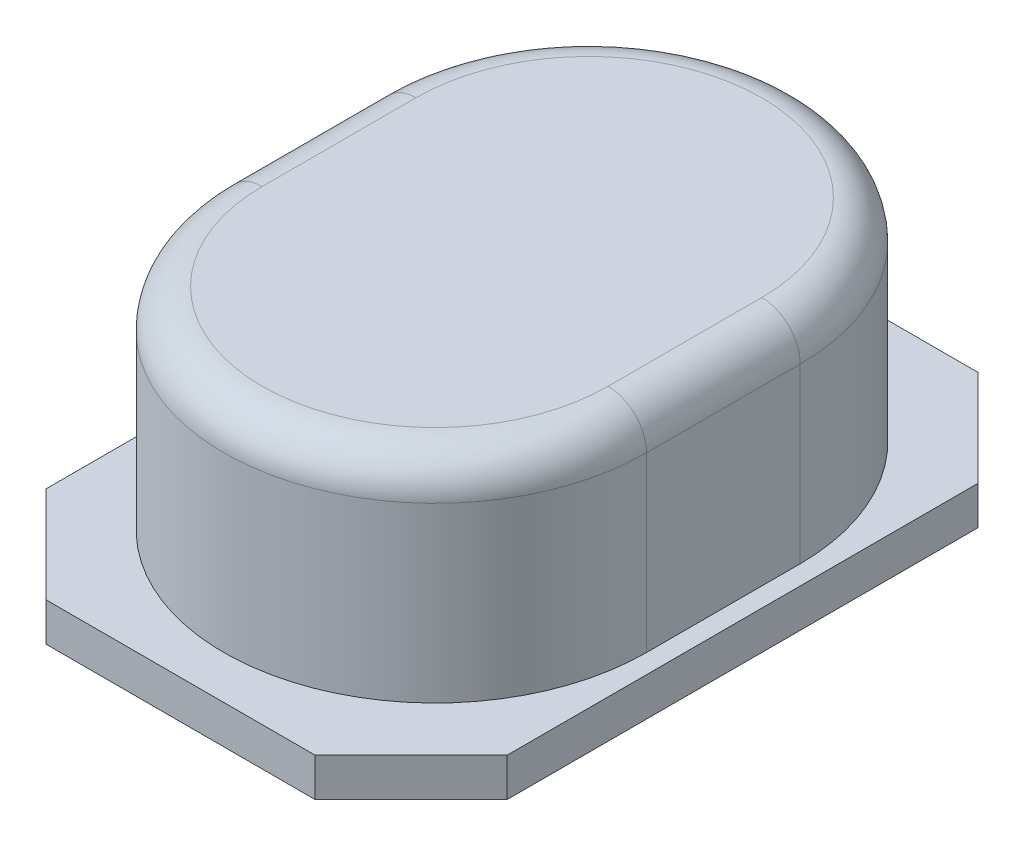
ISO-10303-21;
HEADER;
FILE_DESCRIPTION(('STEP AP214'),'2;1');
FILE_NAME('part.step','',(''),(''),'','','');
FILE_SCHEMA(('AUTOMOTIVE_DESIGN { 1 0 10303 214 1 1 1 1 }'));
ENDSEC;
DATA;
#1=APPLICATION_CONTEXT('core data for automotive mechanical design processes');
#2=APPLICATION_PROTOCOL_DEFINITION('international standard','automotive_design',2000,#1);
#3=PRODUCT_CONTEXT('',#1,'mechanical');
#4=PRODUCT('Part','Part','',(#3));
#5=PRODUCT_RELATED_PRODUCT_CATEGORY('part','',(#4));
#6=PRODUCT_DEFINITION_FORMATION('','',#4);
#7=PRODUCT_DEFINITION_CONTEXT('part definition',#1,'design');
#8=PRODUCT_DEFINITION('design','',#6,#7);
#9=PRODUCT_DEFINITION_SHAPE('','',#8);
#10=(LENGTH_UNIT() NAMED_UNIT(*) SI_UNIT(.MILLI.,.METRE.));
#11=(NAMED_UNIT(*) PLANE_ANGLE_UNIT() SI_UNIT($,.RADIAN.));
#12=(NAMED_UNIT(*) SI_UNIT($,.STERADIAN.) SOLID_ANGLE_UNIT());
#13=UNCERTAINTY_MEASURE_WITH_UNIT(LENGTH_MEASURE(1.E-05),#10,'distance_accuracy_value','');
#14=(GEOMETRIC_REPRESENTATION_CONTEXT(3) GLOBAL_UNCERTAINTY_ASSIGNED_CONTEXT((#13)) GLOBAL_UNIT_ASSIGNED_CONTEXT((#10,
#11,#12)) REPRESENTATION_CONTEXT('',''));
#15=CARTESIAN_POINT('',(0.,0.,0.));
#16=DIRECTION('',(0.,0.,1.));
#17=DIRECTION('',(1.,0.,0.));
#18=AXIS2_PLACEMENT_3D('',#15,#16,#17);
#19=CARTESIAN_POINT('',(0.,-0.5,0.));
#20=DIRECTION('',(0.,-1.,0.));
#21=DIRECTION('',(0.,0.,1.));
#22=AXIS2_PLACEMENT_3D('',#19,#20,#21);
#23=CYLINDRICAL_SURFACE('',#22,0.375);
#24=CARTESIAN_POINT('',(0.,-0.5,0.));
#25=DIRECTION('',(0.,1.,0.));
#26=DIRECTION('',(1.,0.,0.));
#27=AXIS2_PLACEMENT_3D('',#24,#25,#26);
#28=CIRCLE('',#27,0.375);
#29=CARTESIAN_POINT('',(0.,-0.5,-0.375));
#30=VERTEX_POINT('',#29);
#31=EDGE_CURVE('E432',#30,#30,#28,.T.);
#32=ORIENTED_EDGE('',*,*,#31,.T.);
#33=DIRECTION('',(0.,1.,0.));
#34=VECTOR('',#33,1.);
#35=CARTESIAN_POINT('',(0.,-0.5,-0.375));
#36=LINE('',#35,#34);
#37=CARTESIAN_POINT('',(0.,-0.2,-0.375));
#38=VERTEX_POINT('',#37);
#39=EDGE_CURVE('E11',#30,#38,#36,.T.);
#40=ORIENTED_EDGE('',*,*,#39,.T.);
#41=CARTESIAN_POINT('',(0.,-0.2,0.));
#42=DIRECTION('',(0.,1.,0.));
#43=DIRECTION('',(0.,0.,1.));
#44=AXIS2_PLACEMENT_3D('',#41,#42,#43);
#45=CIRCLE('',#44,0.375);
#46=CARTESIAN_POINT('',(0.15,-0.2,-0.343693177121688));
#47=VERTEX_POINT('',#46);
#48=EDGE_CURVE('E20',#47,#38,#45,.T.);
#49=ORIENTED_EDGE('',*,*,#48,.F.);
#50=DIRECTION('',(0.,-1.,0.));
#51=VECTOR('',#50,1.);
#52=CARTESIAN_POINT('',(0.15,-0.5,-0.343693177121688));
#53=LINE('',#52,#51);
#54=CARTESIAN_POINT('',(0.15,0.1,-0.343693177121688));
#55=VERTEX_POINT('',#54);
#56=EDGE_CURVE('E303',#55,#47,#53,.T.);
#57=ORIENTED_EDGE('',*,*,#56,.F.);
#58=CARTESIAN_POINT('',(0.,0.1,0.));
#59=DIRECTION('',(0.,1.,0.));
#60=DIRECTION('',(1.,0.,0.));
#61=AXIS2_PLACEMENT_3D('',#58,#59,#60);
#62=CIRCLE('',#61,0.375);
#63=CARTESIAN_POINT('',(0.343693177121688,0.1,-0.15));
#64=VERTEX_POINT('',#63);
#65=EDGE_CURVE('E27',#64,#55,#62,.T.);
#66=ORIENTED_EDGE('',*,*,#65,.F.);
#67=DIRECTION('',(0.,1.,0.));
#68=VECTOR('',#67,1.);
#69=CARTESIAN_POINT('',(0.343693177121688,-0.5,-0.15));
#70=LINE('',#69,#68);
#71=CARTESIAN_POINT('',(0.343693177121688,-0.2,-0.15));
#72=VERTEX_POINT('',#71);
#73=EDGE_CURVE('E307',#72,#64,#70,.T.);
#74=ORIENTED_EDGE('',*,*,#73,.F.);
#75=CARTESIAN_POINT('',(0.,-0.2,0.));
#76=DIRECTION('',(0.,1.,0.));
#77=DIRECTION('',(0.,0.,1.));
#78=AXIS2_PLACEMENT_3D('',#75,#76,#77);
#79=CIRCLE('',#78,0.375);
#80=CARTESIAN_POINT('',(0.343693177121688,-0.2,0.15));
#81=VERTEX_POINT('',#80);
#82=EDGE_CURVE('E368',#81,#72,#79,.T.);
#83=ORIENTED_EDGE('',*,*,#82,.F.);
#84=DIRECTION('',(0.,-1.,0.));
#85=VECTOR('',#84,1.);
#86=CARTESIAN_POINT('',(0.343693177121688,-0.5,0.15));
#87=LINE('',#86,#85);
#88=CARTESIAN_POINT('',(0.343693177121688,0.1,0.15));
#89=VERTEX_POINT('',#88);
#90=EDGE_CURVE('E485',#89,#81,#87,.T.);
#91=ORIENTED_EDGE('',*,*,#90,.F.);
#92=CARTESIAN_POINT('',(0.,0.1,0.));
#93=DIRECTION('',(0.,1.,0.));
#94=DIRECTION('',(1.,0.,0.));
#95=AXIS2_PLACEMENT_3D('',#92,#93,#94);
#96=CIRCLE('',#95,0.375);
#97=CARTESIAN_POINT('',(0.15,0.1,0.343693177121688));
#98=VERTEX_POINT('',#97);
#99=EDGE_CURVE('E325',#98,#89,#96,.T.);
#100=ORIENTED_EDGE('',*,*,#99,.F.);
#101=DIRECTION('',(0.,1.,0.));
#102=VECTOR('',#101,1.);
#103=CARTESIAN_POINT('',(0.15,-0.5,0.343693177121688));
#104=LINE('',#103,#102);
#105=CARTESIAN_POINT('',(0.15,-0.2,0.343693177121688));
#106=VERTEX_POINT('',#105);
#107=EDGE_CURVE('E354',#106,#98,#104,.T.);
#108=ORIENTED_EDGE('',*,*,#107,.F.);
#109=CARTESIAN_POINT('',(0.,-0.2,0.));
#110=DIRECTION('',(0.,1.,0.));
#111=DIRECTION('',(0.,0.,1.));
#112=AXIS2_PLACEMENT_3D('',#109,#110,#111);
#113=CIRCLE('',#112,0.375);
#114=CARTESIAN_POINT('',(-0.15,-0.2,0.343693177121688));
#115=VERTEX_POINT('',#114);
#116=EDGE_CURVE('E392',#115,#106,#113,.T.);
#117=ORIENTED_EDGE('',*,*,#116,.F.);
#118=DIRECTION('',(0.,-1.,0.));
#119=VECTOR('',#118,1.);
#120=CARTESIAN_POINT('',(-0.15,-0.5,0.343693177121688));
#121=LINE('',#120,#119);
#122=CARTESIAN_POINT('',(-0.15,0.1,0.343693177121688));
#123=VERTEX_POINT('',#122);
#124=EDGE_CURVE('E378',#123,#115,#121,.T.);
#125=ORIENTED_EDGE('',*,*,#124,.F.);
#126=CARTESIAN_POINT('',(0.,0.1,0.));
#127=DIRECTION('',(0.,1.,0.));
#128=DIRECTION('',(1.,0.,0.));
#129=AXIS2_PLACEMENT_3D('',#126,#127,#128);
#130=CIRCLE('',#129,0.375);
#131=CARTESIAN_POINT('',(-0.343693177121688,0.1,0.15));
#132=VERTEX_POINT('',#131);
#133=EDGE_CURVE('E498',#132,#123,#130,.T.);
#134=ORIENTED_EDGE('',*,*,#133,.F.);
#135=DIRECTION('',(0.,1.,0.));
#136=VECTOR('',#135,1.);
#137=CARTESIAN_POINT('',(-0.343693177121688,-0.5,0.15));
#138=LINE('',#137,#136);
#139=CARTESIAN_POINT('',(-0.343693177121688,-0.2,0.15));
#140=VERTEX_POINT('',#139);
#141=EDGE_CURVE('E361',#140,#132,#138,.T.);
#142=ORIENTED_EDGE('',*,*,#141,.F.);
#143=CARTESIAN_POINT('',(0.,-0.2,0.));
#144=DIRECTION('',(0.,1.,0.));
#145=DIRECTION('',(0.,0.,1.));
#146=AXIS2_PLACEMENT_3D('',#143,#144,#145);
#147=CIRCLE('',#146,0.375);
#148=CARTESIAN_POINT('',(-0.343693177121688,-0.2,-0.15));
#149=VERTEX_POINT('',#148);
#150=EDGE_CURVE('E312',#149,#140,#147,.T.);
#151=ORIENTED_EDGE('',*,*,#150,.F.);
#152=DIRECTION('',(0.,-1.,0.));
#153=VECTOR('',#152,1.);
#154=CARTESIAN_POINT('',(-0.343693177121688,-0.5,-0.15));
#155=LINE('',#154,#153);
#156=CARTESIAN_POINT('',(-0.343693177121688,0.1,-0.15));
#157=VERTEX_POINT('',#156);
#158=EDGE_CURVE('E135',#157,#149,#155,.T.);
#159=ORIENTED_EDGE('',*,*,#158,.F.);
#160=CARTESIAN_POINT('',(0.,0.1,0.));
#161=DIRECTION('',(0.,1.,0.));
#162=DIRECTION('',(1.,0.,0.));
#163=AXIS2_PLACEMENT_3D('',#160,#161,#162);
#164=CIRCLE('',#163,0.375);
#165=CARTESIAN_POINT('',(-0.15,0.1,-0.343693177121688));
#166=VERTEX_POINT('',#165);
#167=EDGE_CURVE('E305',#166,#157,#164,.T.);
#168=ORIENTED_EDGE('',*,*,#167,.F.);
#169=DIRECTION('',(0.,1.,0.));
#170=VECTOR('',#169,1.);
#171=CARTESIAN_POINT('',(-0.15,-0.5,-0.343693177121688));
#172=LINE('',#171,#170);
#173=CARTESIAN_POINT('',(-0.15,-0.2,-0.343693177121688));
#174=VERTEX_POINT('',#173);
#175=EDGE_CURVE('E501',#174,#166,#172,.T.);
#176=ORIENTED_EDGE('',*,*,#175,.F.);
#177=CARTESIAN_POINT('',(0.,-0.2,0.));
#178=DIRECTION('',(0.,1.,0.));
#179=DIRECTION('',(0.,0.,1.));
#180=AXIS2_PLACEMENT_3D('',#177,#178,#179);
#181=CIRCLE('',#180,0.375);
#182=EDGE_CURVE('E444',#38,#174,#181,.T.);
#183=ORIENTED_EDGE('',*,*,#182,.F.);
#184=ORIENTED_EDGE('',*,*,#39,.F.);
#185=EDGE_LOOP('',(#32,#40,#49,#57,#66,#74,#83,#91,#100,#108,#117,#125,#134,#142,#151,#159,#168,
#176,#183,#184));
#186=FACE_BOUND('',#185,.T.);
#187=ADVANCED_FACE('F16',(#186),#23,.T.);
#188=CARTESIAN_POINT('',(0.,0.1,0.));
#189=DIRECTION('',(0.,-1.,0.));
#190=DIRECTION('',(0.,0.,-1.));
#191=AXIS2_PLACEMENT_3D('',#188,#189,#190);
#192=PLANE('',#191);
#193=ORIENTED_EDGE('',*,*,#65,.T.);
#194=DIRECTION('',(0.,0.,-1.));
#195=VECTOR('',#194,1.);
#196=CARTESIAN_POINT('',(0.15,0.1,-0.15));
#197=LINE('',#196,#195);
#198=CARTESIAN_POINT('',(0.15,0.1,-0.734846922834954));
#199=VERTEX_POINT('',#198);
#200=EDGE_CURVE('E477',#55,#199,#197,.T.);
#201=ORIENTED_EDGE('',*,*,#200,.T.);
#202=CARTESIAN_POINT('',(0.,0.1,0.));
#203=DIRECTION('',(0.,-1.,0.));
#204=DIRECTION('',(1.,0.,0.));
#205=AXIS2_PLACEMENT_3D('',#202,#203,#204);
#206=CIRCLE('',#205,0.75);
#207=CARTESIAN_POINT('',(0.734846922834954,0.1,-0.15));
#208=VERTEX_POINT('',#207);
#209=EDGE_CURVE('E41',#199,#208,#206,.T.);
#210=ORIENTED_EDGE('',*,*,#209,.T.);
#211=DIRECTION('',(-1.,0.,0.));
#212=VECTOR('',#211,1.);
#213=CARTESIAN_POINT('',(0.734846922834953,0.1,-0.15));
#214=LINE('',#213,#212);
#215=EDGE_CURVE('E396',#208,#64,#214,.T.);
#216=ORIENTED_EDGE('',*,*,#215,.T.);
#217=EDGE_LOOP('',(#193,#201,#210,#216));
#218=FACE_BOUND('',#217,.T.);
#219=ADVANCED_FACE('F18',(#218),#192,.T.);
#220=CARTESIAN_POINT('',(0.,0.1,0.));
#221=DIRECTION('',(0.,1.,0.));
#222=DIRECTION('',(0.,0.,-1.));
#223=AXIS2_PLACEMENT_3D('',#220,#221,#222);
#224=CYLINDRICAL_SURFACE('',#223,0.75);
#225=CARTESIAN_POINT('',(0.,-0.2,0.));
#226=DIRECTION('',(0.,-1.,0.));
#227=DIRECTION('',(1.,0.,0.));
#228=AXIS2_PLACEMENT_3D('',#225,#226,#227);
#229=CIRCLE('',#228,0.75);
#230=CARTESIAN_POINT('',(0.15,-0.2,-0.734846922834954));
#231=VERTEX_POINT('',#230);
#232=CARTESIAN_POINT('',(0.734846922834954,-0.2,-0.15));
#233=VERTEX_POINT('',#232);
#234=EDGE_CURVE('E389',#231,#233,#229,.T.);
#235=ORIENTED_EDGE('',*,*,#234,.T.);
#236=DIRECTION('',(0.,-1.,0.));
#237=VECTOR('',#236,1.);
#238=CARTESIAN_POINT('',(0.734846922834954,0.1,-0.15));
#239=LINE('',#238,#237);
#240=EDGE_CURVE('E474',#208,#233,#239,.T.);
#241=ORIENTED_EDGE('',*,*,#240,.F.);
#242=ORIENTED_EDGE('',*,*,#209,.F.);
#243=DIRECTION('',(0.,-1.,0.));
#244=VECTOR('',#243,1.);
#245=CARTESIAN_POINT('',(0.15,0.1,-0.734846922834954));
#246=LINE('',#245,#244);
#247=EDGE_CURVE('E455',#199,#231,#246,.T.);
#248=ORIENTED_EDGE('',*,*,#247,.T.);
#249=EDGE_LOOP('',(#235,#241,#242,#248));
#250=FACE_BOUND('',#249,.T.);
#251=ADVANCED_FACE('F823',(#250),#224,.F.);
#252=CARTESIAN_POINT('',(0.15,0.1,-0.15));
#253=DIRECTION('',(-1.,0.,0.));
#254=DIRECTION('',(0.,1.,0.));
#255=AXIS2_PLACEMENT_3D('',#252,#253,#254);
#256=PLANE('',#255);
#257=ORIENTED_EDGE('',*,*,#200,.F.);
#258=ORIENTED_EDGE('',*,*,#56,.T.);
#259=DIRECTION('',(0.,0.,-1.));
#260=VECTOR('',#259,1.);
#261=CARTESIAN_POINT('',(0.15,-0.2,-0.15));
#262=LINE('',#261,#260);
#263=EDGE_CURVE('E385',#47,#231,#262,.T.);
#264=ORIENTED_EDGE('',*,*,#263,.T.);
#265=ORIENTED_EDGE('',*,*,#247,.F.);
#266=EDGE_LOOP('',(#257,#258,#264,#265));
#267=FACE_BOUND('',#266,.T.);
#268=ADVANCED_FACE('F818',(#267),#256,.F.);
#269=CARTESIAN_POINT('',(0.734846922834953,0.1,-0.15));
#270=DIRECTION('',(0.,0.,1.));
#271=DIRECTION('',(1.,0.,0.));
#272=AXIS2_PLACEMENT_3D('',#269,#270,#271);
#273=PLANE('',#272);
#274=DIRECTION('',(-1.,0.,0.));
#275=VECTOR('',#274,1.);
#276=CARTESIAN_POINT('',(0.734846922834953,-0.2,-0.15));
#277=LINE('',#276,#275);
#278=EDGE_CURVE('E409',#233,#72,#277,.T.);
#279=ORIENTED_EDGE('',*,*,#278,.T.);
#280=ORIENTED_EDGE('',*,*,#73,.T.);
#281=ORIENTED_EDGE('',*,*,#215,.F.);
#282=ORIENTED_EDGE('',*,*,#240,.T.);
#283=EDGE_LOOP('',(#279,#280,#281,#282));
#284=FACE_BOUND('',#283,.T.);
#285=ADVANCED_FACE('F822',(#284),#273,.F.);
#286=CARTESIAN_POINT('',(0.,0.1,0.));
#287=DIRECTION('',(0.,-1.,0.));
#288=DIRECTION('',(0.,0.,-1.));
#289=AXIS2_PLACEMENT_3D('',#286,#287,#288);
#290=PLANE('',#289);
#291=ORIENTED_EDGE('',*,*,#167,.T.);
#292=DIRECTION('',(-1.,0.,0.));
#293=VECTOR('',#292,1.);
#294=CARTESIAN_POINT('',(-0.15,0.1,-0.15));
#295=LINE('',#294,#293);
#296=CARTESIAN_POINT('',(-0.734846922834954,0.1,-0.15));
#297=VERTEX_POINT('',#296);
#298=EDGE_CURVE('E374',#157,#297,#295,.T.);
#299=ORIENTED_EDGE('',*,*,#298,.T.);
#300=CARTESIAN_POINT('',(0.,0.1,0.));
#301=DIRECTION('',(0.,-1.,0.));
#302=DIRECTION('',(1.,0.,0.));
#303=AXIS2_PLACEMENT_3D('',#300,#301,#302);
#304=CIRCLE('',#303,0.75);
#305=CARTESIAN_POINT('',(-0.15,0.1,-0.734846922834954));
#306=VERTEX_POINT('',#305);
#307=EDGE_CURVE('E308',#297,#306,#304,.T.);
#308=ORIENTED_EDGE('',*,*,#307,.T.);
#309=DIRECTION('',(0.,0.,1.));
#310=VECTOR('',#309,1.);
#311=CARTESIAN_POINT('',(-0.15,0.1,-0.734846922834954));
#312=LINE('',#311,#310);
#313=EDGE_CURVE('E375',#306,#166,#312,.T.);
#314=ORIENTED_EDGE('',*,*,#313,.T.);
#315=EDGE_LOOP('',(#291,#299,#308,#314));
#316=FACE_BOUND('',#315,.T.);
#317=ADVANCED_FACE('F837',(#316),#290,.T.);
#318=CARTESIAN_POINT('',(0.,0.1,0.));
#319=DIRECTION('',(0.,1.,0.));
#320=DIRECTION('',(0.,0.,-1.));
#321=AXIS2_PLACEMENT_3D('',#318,#319,#320);
#322=CYLINDRICAL_SURFACE('',#321,0.75);
#323=CARTESIAN_POINT('',(0.,-0.2,0.));
#324=DIRECTION('',(0.,-1.,0.));
#325=DIRECTION('',(1.,0.,0.));
#326=AXIS2_PLACEMENT_3D('',#323,#324,#325);
#327=CIRCLE('',#326,0.75);
#328=CARTESIAN_POINT('',(-0.734846922834953,-0.2,-0.15));
#329=VERTEX_POINT('',#328);
#330=CARTESIAN_POINT('',(-0.15,-0.2,-0.734846922834954));
#331=VERTEX_POINT('',#330);
#332=EDGE_CURVE('E314',#329,#331,#327,.T.);
#333=ORIENTED_EDGE('',*,*,#332,.T.);
#334=DIRECTION('',(0.,-1.,0.));
#335=VECTOR('',#334,1.);
#336=CARTESIAN_POINT('',(-0.15,0.1,-0.734846922834954));
#337=LINE('',#336,#335);
#338=EDGE_CURVE('E371',#306,#331,#337,.T.);
#339=ORIENTED_EDGE('',*,*,#338,.F.);
#340=ORIENTED_EDGE('',*,*,#307,.F.);
#341=DIRECTION('',(0.,-1.,0.));
#342=VECTOR('',#341,1.);
#343=CARTESIAN_POINT('',(-0.734846922834954,0.1,-0.15));
#344=LINE('',#343,#342);
#345=EDGE_CURVE('E421',#297,#329,#344,.T.);
#346=ORIENTED_EDGE('',*,*,#345,.T.);
#347=EDGE_LOOP('',(#333,#339,#340,#346));
#348=FACE_BOUND('',#347,.T.);
#349=ADVANCED_FACE('F782',(#348),#322,.F.);
#350=CARTESIAN_POINT('',(-0.15,0.1,-0.15));
#351=DIRECTION('',(0.,0.,1.));
#352=DIRECTION('',(1.,0.,0.));
#353=AXIS2_PLACEMENT_3D('',#350,#351,#352);
#354=PLANE('',#353);
#355=ORIENTED_EDGE('',*,*,#298,.F.);
#356=ORIENTED_EDGE('',*,*,#158,.T.);
#357=DIRECTION('',(-1.,0.,0.));
#358=VECTOR('',#357,1.);
#359=CARTESIAN_POINT('',(-0.15,-0.2,-0.15));
#360=LINE('',#359,#358);
#361=EDGE_CURVE('E318',#149,#329,#360,.T.);
#362=ORIENTED_EDGE('',*,*,#361,.T.);
#363=ORIENTED_EDGE('',*,*,#345,.F.);
#364=EDGE_LOOP('',(#355,#356,#362,#363));
#365=FACE_BOUND('',#364,.T.);
#366=ADVANCED_FACE('F778',(#365),#354,.F.);
#367=CARTESIAN_POINT('',(-0.15,0.1,-0.734846922834954));
#368=DIRECTION('',(1.,0.,0.));
#369=DIRECTION('',(0.,0.,1.));
#370=AXIS2_PLACEMENT_3D('',#367,#368,#369);
#371=PLANE('',#370);
#372=DIRECTION('',(0.,0.,1.));
#373=VECTOR('',#372,1.);
#374=CARTESIAN_POINT('',(-0.15,-0.2,-0.734846922834954));
#375=LINE('',#374,#373);
#376=EDGE_CURVE('E319',#331,#174,#375,.T.);
#377=ORIENTED_EDGE('',*,*,#376,.T.);
#378=ORIENTED_EDGE('',*,*,#175,.T.);
#379=ORIENTED_EDGE('',*,*,#313,.F.);
#380=ORIENTED_EDGE('',*,*,#338,.T.);
#381=EDGE_LOOP('',(#377,#378,#379,#380));
#382=FACE_BOUND('',#381,.T.);
#383=ADVANCED_FACE('F631',(#382),#371,.F.);
#384=CARTESIAN_POINT('',(0.,0.1,0.));
#385=DIRECTION('',(0.,-1.,0.));
#386=DIRECTION('',(0.,0.,-1.));
#387=AXIS2_PLACEMENT_3D('',#384,#385,#386);
#388=PLANE('',#387);
#389=ORIENTED_EDGE('',*,*,#133,.T.);
#390=DIRECTION('',(0.,0.,1.));
#391=VECTOR('',#390,1.);
#392=CARTESIAN_POINT('',(-0.15,0.1,0.15));
#393=LINE('',#392,#391);
#394=CARTESIAN_POINT('',(-0.15,0.1,0.734846922834954));
#395=VERTEX_POINT('',#394);
#396=EDGE_CURVE('E381',#123,#395,#393,.T.);
#397=ORIENTED_EDGE('',*,*,#396,.T.);
#398=CARTESIAN_POINT('',(0.,0.1,0.));
#399=DIRECTION('',(0.,-1.,0.));
#400=DIRECTION('',(1.,0.,0.));
#401=AXIS2_PLACEMENT_3D('',#398,#399,#400);
#402=CIRCLE('',#401,0.75);
#403=CARTESIAN_POINT('',(-0.734846922834954,0.1,0.15));
#404=VERTEX_POINT('',#403);
#405=EDGE_CURVE('E384',#395,#404,#402,.T.);
#406=ORIENTED_EDGE('',*,*,#405,.T.);
#407=DIRECTION('',(1.,0.,0.));
#408=VECTOR('',#407,1.);
#409=CARTESIAN_POINT('',(-0.734846922834953,0.1,0.15));
#410=LINE('',#409,#408);
#411=EDGE_CURVE('E356',#404,#132,#410,.T.);
#412=ORIENTED_EDGE('',*,*,#411,.T.);
#413=EDGE_LOOP('',(#389,#397,#406,#412));
#414=FACE_BOUND('',#413,.T.);
#415=ADVANCED_FACE('F871',(#414),#388,.T.);
#416=CARTESIAN_POINT('',(0.,0.1,0.));
#417=DIRECTION('',(0.,1.,0.));
#418=DIRECTION('',(0.,0.,-1.));
#419=AXIS2_PLACEMENT_3D('',#416,#417,#418);
#420=CYLINDRICAL_SURFACE('',#419,0.75);
#421=CARTESIAN_POINT('',(0.,-0.2,0.));
#422=DIRECTION('',(0.,-1.,0.));
#423=DIRECTION('',(1.,0.,0.));
#424=AXIS2_PLACEMENT_3D('',#421,#422,#423);
#425=CIRCLE('',#424,0.75);
#426=CARTESIAN_POINT('',(-0.15,-0.2,0.734846922834954));
#427=VERTEX_POINT('',#426);
#428=CARTESIAN_POINT('',(-0.734846922834954,-0.2,0.15));
#429=VERTEX_POINT('',#428);
#430=EDGE_CURVE('E309',#427,#429,#425,.T.);
#431=ORIENTED_EDGE('',*,*,#430,.T.);
#432=DIRECTION('',(0.,-1.,0.));
#433=VECTOR('',#432,1.);
#434=CARTESIAN_POINT('',(-0.734846922834954,0.1,0.15));
#435=LINE('',#434,#433);
#436=EDGE_CURVE('E360',#404,#429,#435,.T.);
#437=ORIENTED_EDGE('',*,*,#436,.F.);
#438=ORIENTED_EDGE('',*,*,#405,.F.);
#439=DIRECTION('',(0.,-1.,0.));
#440=VECTOR('',#439,1.);
#441=CARTESIAN_POINT('',(-0.15,0.1,0.734846922834954));
#442=LINE('',#441,#440);
#443=EDGE_CURVE('E146',#395,#427,#442,.T.);
#444=ORIENTED_EDGE('',*,*,#443,.T.);
#445=EDGE_LOOP('',(#431,#437,#438,#444));
#446=FACE_BOUND('',#445,.T.);
#447=ADVANCED_FACE('F772',(#446),#420,.F.);
#448=CARTESIAN_POINT('',(-0.15,0.1,0.15));
#449=DIRECTION('',(1.,0.,0.));
#450=DIRECTION('',(0.,0.,-1.));
#451=AXIS2_PLACEMENT_3D('',#448,#449,#450);
#452=PLANE('',#451);
#453=ORIENTED_EDGE('',*,*,#396,.F.);
#454=ORIENTED_EDGE('',*,*,#124,.T.);
#455=DIRECTION('',(0.,0.,1.));
#456=VECTOR('',#455,1.);
#457=CARTESIAN_POINT('',(-0.15,-0.2,0.15));
#458=LINE('',#457,#456);
#459=EDGE_CURVE('E311',#115,#427,#458,.T.);
#460=ORIENTED_EDGE('',*,*,#459,.T.);
#461=ORIENTED_EDGE('',*,*,#443,.F.);
#462=EDGE_LOOP('',(#453,#454,#460,#461));
#463=FACE_BOUND('',#462,.T.);
#464=ADVANCED_FACE('F731',(#463),#452,.F.);
#465=CARTESIAN_POINT('',(0.15,0.1,0.734846922834954));
#466=DIRECTION('',(-1.,0.,0.));
#467=DIRECTION('',(0.,0.,1.));
#468=AXIS2_PLACEMENT_3D('',#465,#466,#467);
#469=PLANE('',#468);
#470=DIRECTION('',(0.,0.,-1.));
#471=VECTOR('',#470,1.);
#472=CARTESIAN_POINT('',(0.15,-0.2,0.734846922834954));
#473=LINE('',#472,#471);
#474=CARTESIAN_POINT('',(0.15,-0.2,0.734846922834954));
#475=VERTEX_POINT('',#474);
#476=EDGE_CURVE('E430',#475,#106,#473,.T.);
#477=ORIENTED_EDGE('',*,*,#476,.T.);
#478=ORIENTED_EDGE('',*,*,#107,.T.);
#479=DIRECTION('',(0.,0.,-1.));
#480=VECTOR('',#479,1.);
#481=CARTESIAN_POINT('',(0.15,0.1,0.734846922834954));
#482=LINE('',#481,#480);
#483=CARTESIAN_POINT('',(0.15,0.1,0.734846922834954));
#484=VERTEX_POINT('',#483);
#485=EDGE_CURVE('E481',#484,#98,#482,.T.);
#486=ORIENTED_EDGE('',*,*,#485,.F.);
#487=DIRECTION('',(0.,-1.,0.));
#488=VECTOR('',#487,1.);
#489=CARTESIAN_POINT('',(0.15,0.1,0.734846922834954));
#490=LINE('',#489,#488);
#491=EDGE_CURVE('E351',#484,#475,#490,.T.);
#492=ORIENTED_EDGE('',*,*,#491,.T.);
#493=EDGE_LOOP('',(#477,#478,#486,#492));
#494=FACE_BOUND('',#493,.T.);
#495=ADVANCED_FACE('F726',(#494),#469,.F.);
#496=CARTESIAN_POINT('',(0.,0.1,0.));
#497=DIRECTION('',(0.,1.,0.));
#498=DIRECTION('',(0.,0.,-1.));
#499=AXIS2_PLACEMENT_3D('',#496,#497,#498);
#500=CYLINDRICAL_SURFACE('',#499,0.75);
#501=CARTESIAN_POINT('',(0.,-0.2,0.));
#502=DIRECTION('',(0.,-1.,0.));
#503=DIRECTION('',(1.,0.,0.));
#504=AXIS2_PLACEMENT_3D('',#501,#502,#503);
#505=CIRCLE('',#504,0.75);
#506=CARTESIAN_POINT('',(0.734846922834953,-0.2,0.15));
#507=VERTEX_POINT('',#506);
#508=EDGE_CURVE('E355',#507,#475,#505,.T.);
#509=ORIENTED_EDGE('',*,*,#508,.T.);
#510=ORIENTED_EDGE('',*,*,#491,.F.);
#511=CARTESIAN_POINT('',(0.,0.1,0.));
#512=DIRECTION('',(0.,-1.,0.));
#513=DIRECTION('',(1.,0.,0.));
#514=AXIS2_PLACEMENT_3D('',#511,#512,#513);
#515=CIRCLE('',#514,0.75);
#516=CARTESIAN_POINT('',(0.734846922834953,0.1,0.15));
#517=VERTEX_POINT('',#516);
#518=EDGE_CURVE('E324',#517,#484,#515,.T.);
#519=ORIENTED_EDGE('',*,*,#518,.F.);
#520=DIRECTION('',(0.,-1.,0.));
#521=VECTOR('',#520,1.);
#522=CARTESIAN_POINT('',(0.734846922834953,0.1,0.15));
#523=LINE('',#522,#521);
#524=EDGE_CURVE('E422',#517,#507,#523,.T.);
#525=ORIENTED_EDGE('',*,*,#524,.T.);
#526=EDGE_LOOP('',(#509,#510,#519,#525));
#527=FACE_BOUND('',#526,.T.);
#528=ADVANCED_FACE('F730',(#527),#500,.F.);
#529=CARTESIAN_POINT('',(0.,-0.2,0.));
#530=DIRECTION('',(0.,1.,0.));
#531=DIRECTION('',(1.,0.,0.));
#532=AXIS2_PLACEMENT_3D('',#529,#530,#531);
#533=PLANE('',#532);
#534=DIRECTION('',(1.,0.,0.));
#535=VECTOR('',#534,1.);
#536=CARTESIAN_POINT('',(0.15,-0.2,0.15));
#537=LINE('',#536,#535);
#538=EDGE_CURVE('E427',#81,#507,#537,.T.);
#539=ORIENTED_EDGE('',*,*,#538,.F.);
#540=ORIENTED_EDGE('',*,*,#82,.T.);
#541=ORIENTED_EDGE('',*,*,#278,.F.);
#542=ORIENTED_EDGE('',*,*,#234,.F.);
#543=ORIENTED_EDGE('',*,*,#263,.F.);
#544=ORIENTED_EDGE('',*,*,#48,.T.);
#545=ORIENTED_EDGE('',*,*,#182,.T.);
#546=ORIENTED_EDGE('',*,*,#376,.F.);
#547=ORIENTED_EDGE('',*,*,#332,.F.);
#548=ORIENTED_EDGE('',*,*,#361,.F.);
#549=ORIENTED_EDGE('',*,*,#150,.T.);
#550=DIRECTION('',(1.,0.,0.));
#551=VECTOR('',#550,1.);
#552=CARTESIAN_POINT('',(-0.734846922834953,-0.2,0.15));
#553=LINE('',#552,#551);
#554=EDGE_CURVE('E511',#429,#140,#553,.T.);
#555=ORIENTED_EDGE('',*,*,#554,.F.);
#556=ORIENTED_EDGE('',*,*,#430,.F.);
#557=ORIENTED_EDGE('',*,*,#459,.F.);
#558=ORIENTED_EDGE('',*,*,#116,.T.);
#559=ORIENTED_EDGE('',*,*,#476,.F.);
#560=ORIENTED_EDGE('',*,*,#508,.F.);
#561=EDGE_LOOP('',(#539,#540,#541,#542,#543,#544,#545,#546,#547,#548,#549,#555,#556,#557,#558,
#559,#560));
#562=FACE_BOUND('',#561,.T.);
#563=DIRECTION('',(-0.707106781186548,0.,0.707106781186547));
#564=VECTOR('',#563,1.);
#565=CARTESIAN_POINT('',(-1.2,-0.2,-1.225));
#566=LINE('',#565,#564);
#567=CARTESIAN_POINT('',(-0.7,-0.2,-1.725));
#568=VERTEX_POINT('',#567);
#569=CARTESIAN_POINT('',(-1.2,-0.2,-1.225));
#570=VERTEX_POINT('',#569);
#571=EDGE_CURVE('E365',#568,#570,#566,.T.);
#572=ORIENTED_EDGE('',*,*,#571,.F.);
#573=DIRECTION('',(-1.,0.,0.));
#574=VECTOR('',#573,1.);
#575=CARTESIAN_POINT('',(0.7,-0.2,-1.725));
#576=LINE('',#575,#574);
#577=CARTESIAN_POINT('',(0.7,-0.2,-1.725));
#578=VERTEX_POINT('',#577);
#579=EDGE_CURVE('E329',#578,#568,#576,.T.);
#580=ORIENTED_EDGE('',*,*,#579,.F.);
#581=DIRECTION('',(-0.707106781186548,0.,-0.707106781186547));
#582=VECTOR('',#581,1.);
#583=CARTESIAN_POINT('',(0.7,-0.2,-1.725));
#584=LINE('',#583,#582);
#585=CARTESIAN_POINT('',(1.2,-0.2,-1.225));
#586=VERTEX_POINT('',#585);
#587=EDGE_CURVE('E273',#586,#578,#584,.T.);
#588=ORIENTED_EDGE('',*,*,#587,.F.);
#589=DIRECTION('',(0.,0.,-1.));
#590=VECTOR('',#589,1.);
#591=CARTESIAN_POINT('',(1.2,-0.2,1.225));
#592=LINE('',#591,#590);
#593=CARTESIAN_POINT('',(1.2,-0.2,1.225));
#594=VERTEX_POINT('',#593);
#595=EDGE_CURVE('E265',#594,#586,#592,.T.);
#596=ORIENTED_EDGE('',*,*,#595,.F.);
#597=DIRECTION('',(0.707106781186548,0.,-0.707106781186547));
#598=VECTOR('',#597,1.);
#599=CARTESIAN_POINT('',(0.7,-0.2,1.725));
#600=LINE('',#599,#598);
#601=CARTESIAN_POINT('',(0.7,-0.2,1.725));
#602=VERTEX_POINT('',#601);
#603=EDGE_CURVE('E270',#602,#594,#600,.T.);
#604=ORIENTED_EDGE('',*,*,#603,.F.);
#605=DIRECTION('',(1.,0.,0.));
#606=VECTOR('',#605,1.);
#607=CARTESIAN_POINT('',(-0.7,-0.2,1.725));
#608=LINE('',#607,#606);
#609=CARTESIAN_POINT('',(-0.7,-0.2,1.725));
#610=VERTEX_POINT('',#609);
#611=EDGE_CURVE('E299',#610,#602,#608,.T.);
#612=ORIENTED_EDGE('',*,*,#611,.F.);
#613=DIRECTION('',(0.707106781186548,0.,0.707106781186547));
#614=VECTOR('',#613,1.);
#615=CARTESIAN_POINT('',(-0.7,-0.2,1.725));
#616=LINE('',#615,#614);
#617=CARTESIAN_POINT('',(-1.2,-0.2,1.225));
#618=VERTEX_POINT('',#617);
#619=EDGE_CURVE('E473',#618,#610,#616,.T.);
#620=ORIENTED_EDGE('',*,*,#619,.F.);
#621=DIRECTION('',(0.,0.,1.));
#622=VECTOR('',#621,1.);
#623=CARTESIAN_POINT('',(-1.2,-0.2,-1.225));
#624=LINE('',#623,#622);
#625=EDGE_CURVE('E470',#570,#618,#624,.T.);
#626=ORIENTED_EDGE('',*,*,#625,.F.);
#627=EDGE_LOOP('',(#572,#580,#588,#596,#604,#612,#620,#626));
#628=FACE_BOUND('',#627,.T.);
#629=ADVANCED_FACE('F268',(#562,#628),#533,.F.);
#630=CARTESIAN_POINT('',(0.7,-0.2,-1.725));
#631=DIRECTION('',(0.,0.,-1.));
#632=DIRECTION('',(0.,-1.,0.));
#633=AXIS2_PLACEMENT_3D('',#630,#631,#632);
#634=PLANE('',#633);
#635=DIRECTION('',(-1.,0.,0.));
#636=VECTOR('',#635,1.);
#637=CARTESIAN_POINT('',(0.7,0.,-1.725));
#638=LINE('',#637,#636);
#639=CARTESIAN_POINT('',(0.7,0.,-1.725));
#640=VERTEX_POINT('',#639);
#641=CARTESIAN_POINT('',(-0.7,0.,-1.725));
#642=VERTEX_POINT('',#641);
#643=EDGE_CURVE('E516',#640,#642,#638,.T.);
#644=ORIENTED_EDGE('',*,*,#643,.F.);
#645=DIRECTION('',(0.,1.,0.));
#646=VECTOR('',#645,1.);
#647=CARTESIAN_POINT('',(0.7,-0.2,-1.725));
#648=LINE('',#647,#646);
#649=EDGE_CURVE('E326',#578,#640,#648,.T.);
#650=ORIENTED_EDGE('',*,*,#649,.F.);
#651=ORIENTED_EDGE('',*,*,#579,.T.);
#652=DIRECTION('',(0.,1.,0.));
#653=VECTOR('',#652,1.);
#654=CARTESIAN_POINT('',(-0.7,-0.2,-1.725));
#655=LINE('',#654,#653);
#656=EDGE_CURVE('E362',#568,#642,#655,.T.);
#657=ORIENTED_EDGE('',*,*,#656,.T.);
#658=EDGE_LOOP('',(#644,#650,#651,#657));
#659=FACE_BOUND('',#658,.T.);
#660=ADVANCED_FACE('F709',(#659),#634,.T.);
#661=CARTESIAN_POINT('',(0.7,-0.2,-1.725));
#662=DIRECTION('',(0.707106781186547,0.,-0.707106781186548));
#663=DIRECTION('',(0.,-1.,0.));
#664=AXIS2_PLACEMENT_3D('',#661,#662,#663);
#665=PLANE('',#664);
#666=DIRECTION('',(-0.707106781186548,0.,-0.707106781186547));
#667=VECTOR('',#666,1.);
#668=CARTESIAN_POINT('',(0.7,0.,-1.725));
#669=LINE('',#668,#667);
#670=CARTESIAN_POINT('',(1.2,0.,-1.225));
#671=VERTEX_POINT('',#670);
#672=EDGE_CURVE('E520',#671,#640,#669,.T.);
#673=ORIENTED_EDGE('',*,*,#672,.F.);
#674=DIRECTION('',(0.,1.,0.));
#675=VECTOR('',#674,1.);
#676=CARTESIAN_POINT('',(1.2,-0.2,-1.225));
#677=LINE('',#676,#675);
#678=EDGE_CURVE('E277',#586,#671,#677,.T.);
#679=ORIENTED_EDGE('',*,*,#678,.F.);
#680=ORIENTED_EDGE('',*,*,#587,.T.);
#681=ORIENTED_EDGE('',*,*,#649,.T.);
#682=EDGE_LOOP('',(#673,#679,#680,#681));
#683=FACE_BOUND('',#682,.T.);
#684=ADVANCED_FACE('F657',(#683),#665,.T.);
#685=CARTESIAN_POINT('',(1.2,-0.2,1.225));
#686=DIRECTION('',(1.,0.,0.));
#687=DIRECTION('',(0.,1.,0.));
#688=AXIS2_PLACEMENT_3D('',#685,#686,#687);
#689=PLANE('',#688);
#690=DIRECTION('',(0.,0.,-1.));
#691=VECTOR('',#690,1.);
#692=CARTESIAN_POINT('',(1.2,0.,1.225));
#693=LINE('',#692,#691);
#694=CARTESIAN_POINT('',(1.2,0.,1.225));
#695=VERTEX_POINT('',#694);
#696=EDGE_CURVE('E283',#695,#671,#693,.T.);
#697=ORIENTED_EDGE('',*,*,#696,.F.);
#698=DIRECTION('',(0.,1.,0.));
#699=VECTOR('',#698,1.);
#700=CARTESIAN_POINT('',(1.2,-0.2,1.225));
#701=LINE('',#700,#699);
#702=EDGE_CURVE('E278',#594,#695,#701,.T.);
#703=ORIENTED_EDGE('',*,*,#702,.F.);
#704=ORIENTED_EDGE('',*,*,#595,.T.);
#705=ORIENTED_EDGE('',*,*,#678,.T.);
#706=EDGE_LOOP('',(#697,#703,#704,#705));
#707=FACE_BOUND('',#706,.T.);
#708=ADVANCED_FACE('F281',(#707),#689,.T.);
#709=CARTESIAN_POINT('',(0.7,-0.2,1.725));
#710=DIRECTION('',(0.707106781186547,0.,0.707106781186548));
#711=DIRECTION('',(0.,-1.,0.));
#712=AXIS2_PLACEMENT_3D('',#709,#710,#711);
#713=PLANE('',#712);
#714=DIRECTION('',(0.707106781186548,0.,-0.707106781186547));
#715=VECTOR('',#714,1.);
#716=CARTESIAN_POINT('',(0.7,0.,1.725));
#717=LINE('',#716,#715);
#718=CARTESIAN_POINT('',(0.7,0.,1.725));
#719=VERTEX_POINT('',#718);
#720=EDGE_CURVE('E416',#719,#695,#717,.T.);
#721=ORIENTED_EDGE('',*,*,#720,.F.);
#722=DIRECTION('',(0.,1.,0.));
#723=VECTOR('',#722,1.);
#724=CARTESIAN_POINT('',(0.7,-0.2,1.725));
#725=LINE('',#724,#723);
#726=EDGE_CURVE('E291',#602,#719,#725,.T.);
#727=ORIENTED_EDGE('',*,*,#726,.F.);
#728=ORIENTED_EDGE('',*,*,#603,.T.);
#729=ORIENTED_EDGE('',*,*,#702,.T.);
#730=EDGE_LOOP('',(#721,#727,#728,#729));
#731=FACE_BOUND('',#730,.T.);
#732=ADVANCED_FACE('F289',(#731),#713,.T.);
#733=CARTESIAN_POINT('',(-0.7,-0.2,1.725));
#734=DIRECTION('',(0.,0.,1.));
#735=DIRECTION('',(1.,0.,0.));
#736=AXIS2_PLACEMENT_3D('',#733,#734,#735);
#737=PLANE('',#736);
#738=DIRECTION('',(1.,0.,0.));
#739=VECTOR('',#738,1.);
#740=CARTESIAN_POINT('',(-0.7,0.,1.725));
#741=LINE('',#740,#739);
#742=CARTESIAN_POINT('',(-0.7,0.,1.725));
#743=VERTEX_POINT('',#742);
#744=EDGE_CURVE('E349',#743,#719,#741,.T.);
#745=ORIENTED_EDGE('',*,*,#744,.F.);
#746=DIRECTION('',(0.,1.,0.));
#747=VECTOR('',#746,1.);
#748=CARTESIAN_POINT('',(-0.7,-0.2,1.725));
#749=LINE('',#748,#747);
#750=EDGE_CURVE('E462',#610,#743,#749,.T.);
#751=ORIENTED_EDGE('',*,*,#750,.F.);
#752=ORIENTED_EDGE('',*,*,#611,.T.);
#753=ORIENTED_EDGE('',*,*,#726,.T.);
#754=EDGE_LOOP('',(#745,#751,#752,#753));
#755=FACE_BOUND('',#754,.T.);
#756=ADVANCED_FACE('F705',(#755),#737,.T.);
#757=CARTESIAN_POINT('',(-0.7,-0.2,1.725));
#758=DIRECTION('',(-0.707106781186547,0.,0.707106781186548));
#759=DIRECTION('',(0.,1.,0.));
#760=AXIS2_PLACEMENT_3D('',#757,#758,#759);
#761=PLANE('',#760);
#762=DIRECTION('',(0.707106781186548,0.,0.707106781186547));
#763=VECTOR('',#762,1.);
#764=CARTESIAN_POINT('',(-0.7,0.,1.725));
#765=LINE('',#764,#763);
#766=CARTESIAN_POINT('',(-1.2,0.,1.225));
#767=VERTEX_POINT('',#766);
#768=EDGE_CURVE('E345',#767,#743,#765,.T.);
#769=ORIENTED_EDGE('',*,*,#768,.F.);
#770=DIRECTION('',(0.,1.,0.));
#771=VECTOR('',#770,1.);
#772=CARTESIAN_POINT('',(-1.2,-0.2,1.225));
#773=LINE('',#772,#771);
#774=EDGE_CURVE('E493',#618,#767,#773,.T.);
#775=ORIENTED_EDGE('',*,*,#774,.F.);
#776=ORIENTED_EDGE('',*,*,#619,.T.);
#777=ORIENTED_EDGE('',*,*,#750,.T.);
#778=EDGE_LOOP('',(#769,#775,#776,#777));
#779=FACE_BOUND('',#778,.T.);
#780=ADVANCED_FACE('F668',(#779),#761,.T.);
#781=CARTESIAN_POINT('',(-1.2,-0.2,-1.225));
#782=DIRECTION('',(-1.,0.,0.));
#783=DIRECTION('',(0.,0.,1.));
#784=AXIS2_PLACEMENT_3D('',#781,#782,#783);
#785=PLANE('',#784);
#786=DIRECTION('',(0.,0.,1.));
#787=VECTOR('',#786,1.);
#788=CARTESIAN_POINT('',(-1.2,0.,-1.225));
#789=LINE('',#788,#787);
#790=CARTESIAN_POINT('',(-1.2,0.,-1.225));
#791=VERTEX_POINT('',#790);
#792=EDGE_CURVE('E350',#791,#767,#789,.T.);
#793=ORIENTED_EDGE('',*,*,#792,.F.);
#794=DIRECTION('',(0.,1.,0.));
#795=VECTOR('',#794,1.);
#796=CARTESIAN_POINT('',(-1.2,-0.2,-1.225));
#797=LINE('',#796,#795);
#798=EDGE_CURVE('E467',#570,#791,#797,.T.);
#799=ORIENTED_EDGE('',*,*,#798,.F.);
#800=ORIENTED_EDGE('',*,*,#625,.T.);
#801=ORIENTED_EDGE('',*,*,#774,.T.);
#802=EDGE_LOOP('',(#793,#799,#800,#801));
#803=FACE_BOUND('',#802,.T.);
#804=ADVANCED_FACE('F663',(#803),#785,.T.);
#805=CARTESIAN_POINT('',(-1.2,-0.2,-1.225));
#806=DIRECTION('',(-0.707106781186547,0.,-0.707106781186548));
#807=DIRECTION('',(-0.707106781186548,0.,0.707106781186547));
#808=AXIS2_PLACEMENT_3D('',#805,#806,#807);
#809=PLANE('',#808);
#810=DIRECTION('',(-0.707106781186548,0.,0.707106781186547));
#811=VECTOR('',#810,1.);
#812=CARTESIAN_POINT('',(-1.2,0.,-1.225));
#813=LINE('',#812,#811);
#814=EDGE_CURVE('E436',#642,#791,#813,.T.);
#815=ORIENTED_EDGE('',*,*,#814,.F.);
#816=ORIENTED_EDGE('',*,*,#656,.F.);
#817=ORIENTED_EDGE('',*,*,#571,.T.);
#818=ORIENTED_EDGE('',*,*,#798,.T.);
#819=EDGE_LOOP('',(#815,#816,#817,#818));
#820=FACE_BOUND('',#819,.T.);
#821=ADVANCED_FACE('F667',(#820),#809,.T.);
#822=CARTESIAN_POINT('',(0.,1.1,0.399999999999993));
#823=DIRECTION('',(0.,1.,0.));
#824=DIRECTION('',(0.,0.,1.));
#825=AXIS2_PLACEMENT_3D('',#822,#823,#824);
#826=CYLINDRICAL_SURFACE('',#825,1.1);
#827=DIRECTION('',(0.,-1.,0.));
#828=VECTOR('',#827,1.);
#829=CARTESIAN_POINT('',(1.1,1.1,0.399999999999992));
#830=LINE('',#829,#828);
#831=CARTESIAN_POINT('',(1.1,0.9,0.399999999999992));
#832=VERTEX_POINT('',#831);
#833=CARTESIAN_POINT('',(1.1,0.,0.399999999999992));
#834=VERTEX_POINT('',#833);
#835=EDGE_CURVE('E334',#832,#834,#830,.T.);
#836=ORIENTED_EDGE('',*,*,#835,.F.);
#837=CARTESIAN_POINT('',(0.,0.9,0.399999999999993));
#838=DIRECTION('',(0.,-1.,0.));
#839=DIRECTION('',(0.,0.,1.));
#840=AXIS2_PLACEMENT_3D('',#837,#838,#839);
#841=CIRCLE('',#840,1.1);
#842=CARTESIAN_POINT('',(-1.1,0.9,0.399999999999993));
#843=VERTEX_POINT('',#842);
#844=EDGE_CURVE('E466',#832,#843,#841,.T.);
#845=ORIENTED_EDGE('',*,*,#844,.T.);
#846=DIRECTION('',(0.,-1.,0.));
#847=VECTOR('',#846,1.);
#848=CARTESIAN_POINT('',(-1.1,1.1,0.399999999999993));
#849=LINE('',#848,#847);
#850=CARTESIAN_POINT('',(-1.1,0.,0.399999999999993));
#851=VERTEX_POINT('',#850);
#852=EDGE_CURVE('E441',#843,#851,#849,.T.);
#853=ORIENTED_EDGE('',*,*,#852,.T.);
#854=CARTESIAN_POINT('',(0.,0.,0.399999999999993));
#855=DIRECTION('',(0.,1.,0.));
#856=DIRECTION('',(-1.,0.,0.));
#857=AXIS2_PLACEMENT_3D('',#854,#855,#856);
#858=CIRCLE('',#857,1.1);
#859=EDGE_CURVE('E330',#851,#834,#858,.T.);
#860=ORIENTED_EDGE('',*,*,#859,.T.);
#861=EDGE_LOOP('',(#836,#845,#853,#860));
#862=FACE_BOUND('',#861,.T.);
#863=ADVANCED_FACE('F787',(#862),#826,.T.);
#864=CARTESIAN_POINT('',(1.1,1.1,0.399999999999993));
#865=DIRECTION('',(-1.,0.,0.));
#866=DIRECTION('',(0.,0.,1.));
#867=AXIS2_PLACEMENT_3D('',#864,#865,#866);
#868=PLANE('',#867);
#869=DIRECTION('',(0.,-1.,0.));
#870=VECTOR('',#869,1.);
#871=CARTESIAN_POINT('',(1.1,1.1,-0.399999999999993));
#872=LINE('',#871,#870);
#873=CARTESIAN_POINT('',(1.1,0.9,-0.399999999999993));
#874=VERTEX_POINT('',#873);
#875=CARTESIAN_POINT('',(1.1,0.,-0.399999999999993));
#876=VERTEX_POINT('',#875);
#877=EDGE_CURVE('E442',#874,#876,#872,.T.);
#878=ORIENTED_EDGE('',*,*,#877,.F.);
#879=DIRECTION('',(0.,0.,1.));
#880=VECTOR('',#879,1.);
#881=CARTESIAN_POINT('',(1.1,0.9,0.399999999999992));
#882=LINE('',#881,#880);
#883=EDGE_CURVE('E344',#874,#832,#882,.T.);
#884=ORIENTED_EDGE('',*,*,#883,.T.);
#885=ORIENTED_EDGE('',*,*,#835,.T.);
#886=DIRECTION('',(0.,0.,-1.));
#887=VECTOR('',#886,1.);
#888=CARTESIAN_POINT('',(1.1,0.,0.399999999999993));
#889=LINE('',#888,#887);
#890=EDGE_CURVE('E335',#834,#876,#889,.T.);
#891=ORIENTED_EDGE('',*,*,#890,.T.);
#892=EDGE_LOOP('',(#878,#884,#885,#891));
#893=FACE_BOUND('',#892,.T.);
#894=ADVANCED_FACE('F587',(#893),#868,.F.);
#895=CARTESIAN_POINT('',(0.,0.,0.));
#896=DIRECTION('',(0.,1.,0.));
#897=DIRECTION('',(1.,0.,0.));
#898=AXIS2_PLACEMENT_3D('',#895,#896,#897);
#899=PLANE('',#898);
#900=CARTESIAN_POINT('',(0.,0.,-0.399999999999993));
#901=DIRECTION('',(0.,1.,0.));
#902=DIRECTION('',(0.,0.,1.));
#903=AXIS2_PLACEMENT_3D('',#900,#901,#902);
#904=CIRCLE('',#903,1.1);
#905=CARTESIAN_POINT('',(-1.1,0.,-0.399999999999993));
#906=VERTEX_POINT('',#905);
#907=EDGE_CURVE('E438',#876,#906,#904,.T.);
#908=ORIENTED_EDGE('',*,*,#907,.F.);
#909=ORIENTED_EDGE('',*,*,#890,.F.);
#910=ORIENTED_EDGE('',*,*,#859,.F.);
#911=DIRECTION('',(0.,0.,1.));
#912=VECTOR('',#911,1.);
#913=CARTESIAN_POINT('',(-1.1,0.,-0.399999999999993));
#914=LINE('',#913,#912);
#915=EDGE_CURVE('E533',#906,#851,#914,.T.);
#916=ORIENTED_EDGE('',*,*,#915,.F.);
#917=EDGE_LOOP('',(#908,#909,#910,#916));
#918=FACE_BOUND('',#917,.T.);
#919=ORIENTED_EDGE('',*,*,#814,.T.);
#920=ORIENTED_EDGE('',*,*,#792,.T.);
#921=ORIENTED_EDGE('',*,*,#768,.T.);
#922=ORIENTED_EDGE('',*,*,#744,.T.);
#923=ORIENTED_EDGE('',*,*,#720,.T.);
#924=ORIENTED_EDGE('',*,*,#696,.T.);
#925=ORIENTED_EDGE('',*,*,#672,.T.);
#926=ORIENTED_EDGE('',*,*,#643,.T.);
#927=EDGE_LOOP('',(#919,#920,#921,#922,#923,#924,#925,#926));
#928=FACE_BOUND('',#927,.T.);
#929=ADVANCED_FACE('F590',(#918,#928),#899,.T.);
#930=CARTESIAN_POINT('',(0.,1.1,-0.399999999999993));
#931=DIRECTION('',(0.,1.,0.));
#932=DIRECTION('',(1.,0.,0.));
#933=AXIS2_PLACEMENT_3D('',#930,#931,#932);
#934=PLANE('',#933);
#935=CARTESIAN_POINT('',(0.,1.1,0.399999999999993));
#936=DIRECTION('',(0.,1.,0.));
#937=DIRECTION('',(0.,0.,1.));
#938=AXIS2_PLACEMENT_3D('',#935,#936,#937);
#939=CIRCLE('',#938,0.9);
#940=CARTESIAN_POINT('',(-0.9,1.1,0.399999999999993));
#941=VERTEX_POINT('',#940);
#942=CARTESIAN_POINT('',(0.9,1.1,0.399999999999992));
#943=VERTEX_POINT('',#942);
#944=EDGE_CURVE('E492',#941,#943,#939,.T.);
#945=ORIENTED_EDGE('',*,*,#944,.T.);
#946=DIRECTION('',(0.,0.,-1.));
#947=VECTOR('',#946,1.);
#948=CARTESIAN_POINT('',(0.9,1.1,-0.399999999999993));
#949=LINE('',#948,#947);
#950=CARTESIAN_POINT('',(0.9,1.1,-0.399999999999993));
#951=VERTEX_POINT('',#950);
#952=EDGE_CURVE('E343',#943,#951,#949,.T.);
#953=ORIENTED_EDGE('',*,*,#952,.T.);
#954=CARTESIAN_POINT('',(0.,1.1,-0.399999999999993));
#955=DIRECTION('',(0.,1.,0.));
#956=DIRECTION('',(0.,0.,1.));
#957=AXIS2_PLACEMENT_3D('',#954,#955,#956);
#958=CIRCLE('',#957,0.9);
#959=CARTESIAN_POINT('',(-0.9,1.1,-0.399999999999993));
#960=VERTEX_POINT('',#959);
#961=EDGE_CURVE('E410',#951,#960,#958,.T.);
#962=ORIENTED_EDGE('',*,*,#961,.T.);
#963=DIRECTION('',(0.,0.,1.));
#964=VECTOR('',#963,1.);
#965=CARTESIAN_POINT('',(-0.9,1.1,0.399999999999993));
#966=LINE('',#965,#964);
#967=EDGE_CURVE('E437',#960,#941,#966,.T.);
#968=ORIENTED_EDGE('',*,*,#967,.T.);
#969=EDGE_LOOP('',(#945,#953,#962,#968));
#970=FACE_BOUND('',#969,.T.);
#971=ADVANCED_FACE('F756',(#970),#934,.T.);
#972=CARTESIAN_POINT('',(0.,-0.5,0.));
#973=DIRECTION('',(0.,1.,0.));
#974=DIRECTION('',(1.,0.,0.));
#975=AXIS2_PLACEMENT_3D('',#972,#973,#974);
#976=PLANE('',#975);
#977=ORIENTED_EDGE('',*,*,#31,.F.);
#978=EDGE_LOOP('',(#977));
#979=FACE_BOUND('',#978,.T.);
#980=ADVANCED_FACE('F697',(#979),#976,.F.);
#981=CARTESIAN_POINT('',(-0.9,0.9,-0.399999999999993));
#982=DIRECTION('',(0.,0.,1.));
#983=DIRECTION('',(-1.,0.,0.));
#984=AXIS2_PLACEMENT_3D('',#981,#982,#983);
#985=CYLINDRICAL_SURFACE('',#984,0.2);
#986=CARTESIAN_POINT('',(-0.9,0.9,-0.399999999999993));
#987=DIRECTION('',(0.,0.,-1.));
#988=DIRECTION('',(-1.,0.,0.));
#989=AXIS2_PLACEMENT_3D('',#986,#987,#988);
#990=CIRCLE('',#989,0.2);
#991=CARTESIAN_POINT('',(-1.1,0.9,-0.399999999999993));
#992=VERTEX_POINT('',#991);
#993=EDGE_CURVE('E415',#992,#960,#990,.T.);
#994=ORIENTED_EDGE('',*,*,#993,.F.);
#995=DIRECTION('',(0.,0.,-1.));
#996=VECTOR('',#995,1.);
#997=CARTESIAN_POINT('',(-1.1,0.9,-0.399999999999993));
#998=LINE('',#997,#996);
#999=EDGE_CURVE('E515',#843,#992,#998,.T.);
#1000=ORIENTED_EDGE('',*,*,#999,.F.);
#1001=CARTESIAN_POINT('',(-0.9,0.9,0.399999999999993));
#1002=DIRECTION('',(0.,0.,1.));
#1003=DIRECTION('',(1.,0.,0.));
#1004=AXIS2_PLACEMENT_3D('',#1001,#1002,#1003);
#1005=CIRCLE('',#1004,0.2);
#1006=EDGE_CURVE('E414',#941,#843,#1005,.T.);
#1007=ORIENTED_EDGE('',*,*,#1006,.F.);
#1008=ORIENTED_EDGE('',*,*,#967,.F.);
#1009=EDGE_LOOP('',(#994,#1000,#1007,#1008));
#1010=FACE_BOUND('',#1009,.T.);
#1011=ADVANCED_FACE('F692',(#1010),#985,.T.);
#1012=CARTESIAN_POINT('',(0.,0.9,0.399999999999993));
#1013=DIRECTION('',(0.,1.,0.));
#1014=DIRECTION('',(0.,0.,1.));
#1015=AXIS2_PLACEMENT_3D('',#1012,#1013,#1014);
#1016=TOROIDAL_SURFACE('',#1015,0.9,0.2);
#1017=ORIENTED_EDGE('',*,*,#1006,.T.);
#1018=ORIENTED_EDGE('',*,*,#844,.F.);
#1019=CARTESIAN_POINT('',(0.9,0.9,0.399999999999992));
#1020=DIRECTION('',(0.,0.,-1.));
#1021=DIRECTION('',(-1.,0.,0.));
#1022=AXIS2_PLACEMENT_3D('',#1019,#1020,#1021);
#1023=CIRCLE('',#1022,0.2);
#1024=EDGE_CURVE('E405',#943,#832,#1023,.T.);
#1025=ORIENTED_EDGE('',*,*,#1024,.F.);
#1026=ORIENTED_EDGE('',*,*,#944,.F.);
#1027=EDGE_LOOP('',(#1017,#1018,#1025,#1026));
#1028=FACE_BOUND('',#1027,.T.);
#1029=ADVANCED_FACE('F646',(#1028),#1016,.T.);
#1030=CARTESIAN_POINT('',(0.,0.9,-0.399999999999993));
#1031=DIRECTION('',(0.,1.,0.));
#1032=DIRECTION('',(0.,0.,-1.));
#1033=AXIS2_PLACEMENT_3D('',#1030,#1031,#1032);
#1034=TOROIDAL_SURFACE('',#1033,0.9,0.2);
#1035=ORIENTED_EDGE('',*,*,#993,.T.);
#1036=ORIENTED_EDGE('',*,*,#961,.F.);
#1037=CARTESIAN_POINT('',(0.9,0.9,-0.399999999999993));
#1038=DIRECTION('',(0.,0.,1.));
#1039=DIRECTION('',(1.,0.,0.));
#1040=AXIS2_PLACEMENT_3D('',#1037,#1038,#1039);
#1041=CIRCLE('',#1040,0.2);
#1042=EDGE_CURVE('E339',#874,#951,#1041,.T.);
#1043=ORIENTED_EDGE('',*,*,#1042,.F.);
#1044=CARTESIAN_POINT('',(0.,0.9,-0.399999999999993));
#1045=DIRECTION('',(0.,-1.,0.));
#1046=DIRECTION('',(0.,0.,1.));
#1047=AXIS2_PLACEMENT_3D('',#1044,#1045,#1046);
#1048=CIRCLE('',#1047,1.1);
#1049=EDGE_CURVE('E459',#992,#874,#1048,.T.);
#1050=ORIENTED_EDGE('',*,*,#1049,.F.);
#1051=EDGE_LOOP('',(#1035,#1036,#1043,#1050));
#1052=FACE_BOUND('',#1051,.T.);
#1053=ADVANCED_FACE('F597',(#1052),#1034,.T.);
#1054=CARTESIAN_POINT('',(0.9,0.9,-0.399999999999993));
#1055=DIRECTION('',(0.,0.,-1.));
#1056=DIRECTION('',(1.,0.,0.));
#1057=AXIS2_PLACEMENT_3D('',#1054,#1055,#1056);
#1058=CYLINDRICAL_SURFACE('',#1057,0.2);
#1059=ORIENTED_EDGE('',*,*,#1024,.T.);
#1060=ORIENTED_EDGE('',*,*,#883,.F.);
#1061=ORIENTED_EDGE('',*,*,#1042,.T.);
#1062=ORIENTED_EDGE('',*,*,#952,.F.);
#1063=EDGE_LOOP('',(#1059,#1060,#1061,#1062));
#1064=FACE_BOUND('',#1063,.T.);
#1065=ADVANCED_FACE('F602',(#1064),#1058,.T.);
#1066=CARTESIAN_POINT('',(-1.1,1.1,-0.399999999999993));
#1067=DIRECTION('',(1.,0.,0.));
#1068=DIRECTION('',(0.,1.,0.));
#1069=AXIS2_PLACEMENT_3D('',#1066,#1067,#1068);
#1070=PLANE('',#1069);
#1071=ORIENTED_EDGE('',*,*,#852,.F.);
#1072=ORIENTED_EDGE('',*,*,#999,.T.);
#1073=DIRECTION('',(0.,-1.,0.));
#1074=VECTOR('',#1073,1.);
#1075=CARTESIAN_POINT('',(-1.1,1.1,-0.399999999999993));
#1076=LINE('',#1075,#1074);
#1077=EDGE_CURVE('E426',#992,#906,#1076,.T.);
#1078=ORIENTED_EDGE('',*,*,#1077,.T.);
#1079=ORIENTED_EDGE('',*,*,#915,.T.);
#1080=EDGE_LOOP('',(#1071,#1072,#1078,#1079));
#1081=FACE_BOUND('',#1080,.T.);
#1082=ADVANCED_FACE('F856',(#1081),#1070,.F.);
#1083=CARTESIAN_POINT('',(0.,1.1,-0.399999999999993));
#1084=DIRECTION('',(0.,1.,0.));
#1085=DIRECTION('',(0.,0.,-1.));
#1086=AXIS2_PLACEMENT_3D('',#1083,#1084,#1085);
#1087=CYLINDRICAL_SURFACE('',#1086,1.1);
#1088=ORIENTED_EDGE('',*,*,#1077,.F.);
#1089=ORIENTED_EDGE('',*,*,#1049,.T.);
#1090=ORIENTED_EDGE('',*,*,#877,.T.);
#1091=ORIENTED_EDGE('',*,*,#907,.T.);
#1092=EDGE_LOOP('',(#1088,#1089,#1090,#1091));
#1093=FACE_BOUND('',#1092,.T.);
#1094=ADVANCED_FACE('F594',(#1093),#1087,.T.);
#1095=CARTESIAN_POINT('',(0.15,0.1,0.15));
#1096=DIRECTION('',(0.,0.,-1.));
#1097=DIRECTION('',(0.,-1.,0.));
#1098=AXIS2_PLACEMENT_3D('',#1095,#1096,#1097);
#1099=PLANE('',#1098);
#1100=DIRECTION('',(1.,0.,0.));
#1101=VECTOR('',#1100,1.);
#1102=CARTESIAN_POINT('',(0.15,0.1,0.15));
#1103=LINE('',#1102,#1101);
#1104=EDGE_CURVE('E320',#89,#517,#1103,.T.);
#1105=ORIENTED_EDGE('',*,*,#1104,.F.);
#1106=ORIENTED_EDGE('',*,*,#90,.T.);
#1107=ORIENTED_EDGE('',*,*,#538,.T.);
#1108=ORIENTED_EDGE('',*,*,#524,.F.);
#1109=EDGE_LOOP('',(#1105,#1106,#1107,#1108));
#1110=FACE_BOUND('',#1109,.T.);
#1111=ADVANCED_FACE('F680',(#1110),#1099,.F.);
#1112=CARTESIAN_POINT('',(-0.734846922834953,0.1,0.15));
#1113=DIRECTION('',(0.,0.,-1.));
#1114=DIRECTION('',(-1.,0.,0.));
#1115=AXIS2_PLACEMENT_3D('',#1112,#1113,#1114);
#1116=PLANE('',#1115);
#1117=ORIENTED_EDGE('',*,*,#554,.T.);
#1118=ORIENTED_EDGE('',*,*,#141,.T.);
#1119=ORIENTED_EDGE('',*,*,#411,.F.);
#1120=ORIENTED_EDGE('',*,*,#436,.T.);
#1121=EDGE_LOOP('',(#1117,#1118,#1119,#1120));
#1122=FACE_BOUND('',#1121,.T.);
#1123=ADVANCED_FACE('F674',(#1122),#1116,.F.);
#1124=CARTESIAN_POINT('',(0.,0.1,0.));
#1125=DIRECTION('',(0.,-1.,0.));
#1126=DIRECTION('',(0.,0.,-1.));
#1127=AXIS2_PLACEMENT_3D('',#1124,#1125,#1126);
#1128=PLANE('',#1127);
#1129=ORIENTED_EDGE('',*,*,#99,.T.);
#1130=ORIENTED_EDGE('',*,*,#1104,.T.);
#1131=ORIENTED_EDGE('',*,*,#518,.T.);
#1132=ORIENTED_EDGE('',*,*,#485,.T.);
#1133=EDGE_LOOP('',(#1129,#1130,#1131,#1132));
#1134=FACE_BOUND('',#1133,.T.);
#1135=ADVANCED_FACE('F679',(#1134),#1128,.T.);
#1136=CLOSED_SHELL('',(#187,#219,#251,#268,#285,#317,#349,#366,#383,#415,#447,#464,#495,#528,
#629,#660,#684,#708,#732,#756,#780,#804,#821,#863,#894,#929,#971,#980,#1011,#1029,#1053,#1065,
#1082,#1094,#1111,#1123,#1135));
#1137=MANIFOLD_SOLID_BREP('B1',#1136);
#1138=ADVANCED_BREP_SHAPE_REPRESENTATION('',(#18,#1137),#14);
#1139=SHAPE_DEFINITION_REPRESENTATION(#9,#1138);
ENDSEC;
END-ISO-10303-21;
